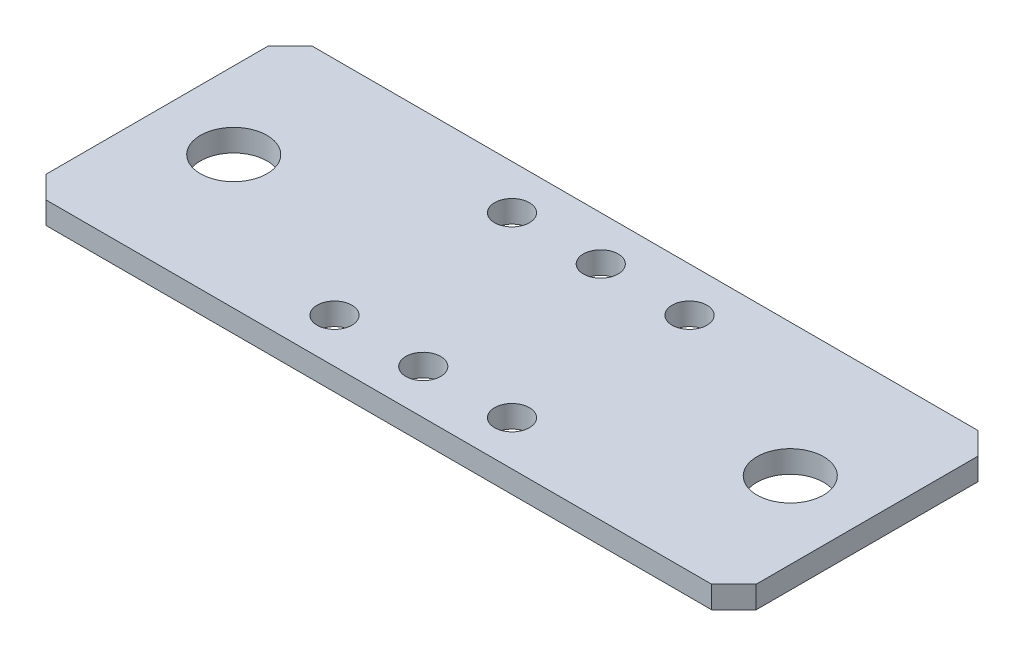
ISO-10303-21;
HEADER;
FILE_DESCRIPTION(('STEP AP214'),'2;1');
FILE_NAME('part.step','',(''),(''),'','','');
FILE_SCHEMA(('AUTOMOTIVE_DESIGN { 1 0 10303 214 1 1 1 1 }'));
ENDSEC;
DATA;
#1=APPLICATION_CONTEXT('core data for automotive mechanical design processes');
#2=APPLICATION_PROTOCOL_DEFINITION('international standard','automotive_design',2000,#1);
#3=PRODUCT_CONTEXT('',#1,'mechanical');
#4=PRODUCT('Part','Part','',(#3));
#5=PRODUCT_RELATED_PRODUCT_CATEGORY('part','',(#4));
#6=PRODUCT_DEFINITION_FORMATION('','',#4);
#7=PRODUCT_DEFINITION_CONTEXT('part definition',#1,'design');
#8=PRODUCT_DEFINITION('design','',#6,#7);
#9=PRODUCT_DEFINITION_SHAPE('','',#8);
#10=(LENGTH_UNIT() NAMED_UNIT(*) SI_UNIT(.MILLI.,.METRE.));
#11=(NAMED_UNIT(*) PLANE_ANGLE_UNIT() SI_UNIT($,.RADIAN.));
#12=(NAMED_UNIT(*) SI_UNIT($,.STERADIAN.) SOLID_ANGLE_UNIT());
#13=UNCERTAINTY_MEASURE_WITH_UNIT(LENGTH_MEASURE(1.E-05),#10,'distance_accuracy_value','');
#14=(GEOMETRIC_REPRESENTATION_CONTEXT(3) GLOBAL_UNCERTAINTY_ASSIGNED_CONTEXT((#13)) GLOBAL_UNIT_ASSIGNED_CONTEXT((#10,
#11,#12)) REPRESENTATION_CONTEXT('',''));
#15=CARTESIAN_POINT('',(0.,0.,0.));
#16=DIRECTION('',(0.,0.,1.));
#17=DIRECTION('',(1.,0.,0.));
#18=AXIS2_PLACEMENT_3D('',#15,#16,#17);
#19=CARTESIAN_POINT('',(0.,0.,0.));
#20=DIRECTION('',(0.,-1.,0.));
#21=DIRECTION('',(0.,0.,-1.));
#22=AXIS2_PLACEMENT_3D('',#19,#20,#21);
#23=PLANE('',#22);
#24=CARTESIAN_POINT('',(38.1,0.,-6.35));
#25=DIRECTION('',(0.,-1.,0.));
#26=DIRECTION('',(0.,0.,-1.));
#27=AXIS2_PLACEMENT_3D('',#24,#25,#26);
#28=CIRCLE('',#27,2.4892);
#29=CARTESIAN_POINT('',(38.1,0.,-8.83920000000001));
#30=VERTEX_POINT('',#29);
#31=EDGE_CURVE('E125',#30,#30,#28,.F.);
#32=ORIENTED_EDGE('',*,*,#31,.T.);
#33=EDGE_LOOP('',(#32));
#34=FACE_BOUND('',#33,.T.);
#35=CARTESIAN_POINT('',(63.5,0.,-6.35));
#36=DIRECTION('',(0.,-1.,0.));
#37=DIRECTION('',(0.,0.,-1.));
#38=AXIS2_PLACEMENT_3D('',#35,#36,#37);
#39=CIRCLE('',#38,2.4892);
#40=CARTESIAN_POINT('',(63.5,0.,-8.83920000000001));
#41=VERTEX_POINT('',#40);
#42=EDGE_CURVE('E131',#41,#41,#39,.F.);
#43=ORIENTED_EDGE('',*,*,#42,.T.);
#44=EDGE_LOOP('',(#43));
#45=FACE_BOUND('',#44,.T.);
#46=CARTESIAN_POINT('',(63.5,0.,-31.75));
#47=DIRECTION('',(0.,-1.,0.));
#48=DIRECTION('',(0.,0.,-1.));
#49=AXIS2_PLACEMENT_3D('',#46,#47,#48);
#50=CIRCLE('',#49,2.4892);
#51=CARTESIAN_POINT('',(63.5,0.,-34.2392));
#52=VERTEX_POINT('',#51);
#53=EDGE_CURVE('E137',#52,#52,#50,.F.);
#54=ORIENTED_EDGE('',*,*,#53,.T.);
#55=EDGE_LOOP('',(#54));
#56=FACE_BOUND('',#55,.T.);
#57=CARTESIAN_POINT('',(90.6145,0.,-19.05));
#58=DIRECTION('',(0.,-1.,0.));
#59=DIRECTION('',(0.,0.,-1.));
#60=AXIS2_PLACEMENT_3D('',#57,#58,#59);
#61=CIRCLE('',#60,4.7625);
#62=CARTESIAN_POINT('',(90.6145,0.,-23.8125));
#63=VERTEX_POINT('',#62);
#64=EDGE_CURVE('E142',#63,#63,#61,.F.);
#65=ORIENTED_EDGE('',*,*,#64,.T.);
#66=EDGE_LOOP('',(#65));
#67=FACE_BOUND('',#66,.T.);
#68=DIRECTION('',(0.,0.,1.));
#69=VECTOR('',#68,1.);
#70=CARTESIAN_POINT('',(101.6,0.,0.));
#71=LINE('',#70,#69);
#72=CARTESIAN_POINT('',(101.6,0.,-34.925));
#73=VERTEX_POINT('',#72);
#74=CARTESIAN_POINT('',(101.6,0.,-3.17499999999999));
#75=VERTEX_POINT('',#74);
#76=EDGE_CURVE('E170',#73,#75,#71,.T.);
#77=ORIENTED_EDGE('',*,*,#76,.T.);
#78=DIRECTION('',(-0.707106781186549,0.,0.707106781186546));
#79=VECTOR('',#78,1.);
#80=CARTESIAN_POINT('',(101.6,0.,-3.17499999999999));
#81=LINE('',#80,#79);
#82=CARTESIAN_POINT('',(98.425,0.,0.));
#83=VERTEX_POINT('',#82);
#84=EDGE_CURVE('E165',#75,#83,#81,.T.);
#85=ORIENTED_EDGE('',*,*,#84,.T.);
#86=DIRECTION('',(-1.,0.,0.));
#87=VECTOR('',#86,1.);
#88=CARTESIAN_POINT('',(0.,0.,0.));
#89=LINE('',#88,#87);
#90=CARTESIAN_POINT('',(3.175,0.,0.));
#91=VERTEX_POINT('',#90);
#92=EDGE_CURVE('E160',#83,#91,#89,.T.);
#93=ORIENTED_EDGE('',*,*,#92,.T.);
#94=DIRECTION('',(-0.707106781186546,0.,-0.707106781186549));
#95=VECTOR('',#94,1.);
#96=CARTESIAN_POINT('',(3.175,0.,0.));
#97=LINE('',#96,#95);
#98=CARTESIAN_POINT('',(0.,0.,-3.17500000000001));
#99=VERTEX_POINT('',#98);
#100=EDGE_CURVE('E155',#91,#99,#97,.T.);
#101=ORIENTED_EDGE('',*,*,#100,.T.);
#102=DIRECTION('',(0.,0.,-1.));
#103=VECTOR('',#102,1.);
#104=CARTESIAN_POINT('',(0.,0.,0.));
#105=LINE('',#104,#103);
#106=CARTESIAN_POINT('',(0.,0.,-34.925));
#107=VERTEX_POINT('',#106);
#108=EDGE_CURVE('E84',#99,#107,#105,.T.);
#109=ORIENTED_EDGE('',*,*,#108,.T.);
#110=DIRECTION('',(0.707106781186551,0.,-0.707106781186544));
#111=VECTOR('',#110,1.);
#112=CARTESIAN_POINT('',(0.,0.,-34.925));
#113=LINE('',#112,#111);
#114=CARTESIAN_POINT('',(3.175,0.,-38.1));
#115=VERTEX_POINT('',#114);
#116=EDGE_CURVE('E82',#107,#115,#113,.T.);
#117=ORIENTED_EDGE('',*,*,#116,.T.);
#118=DIRECTION('',(1.,0.,0.));
#119=VECTOR('',#118,1.);
#120=CARTESIAN_POINT('',(0.,0.,-38.1));
#121=LINE('',#120,#119);
#122=CARTESIAN_POINT('',(98.425,0.,-38.1));
#123=VERTEX_POINT('',#122);
#124=EDGE_CURVE('E79',#115,#123,#121,.T.);
#125=ORIENTED_EDGE('',*,*,#124,.T.);
#126=DIRECTION('',(0.707106781186544,0.,0.707106781186551));
#127=VECTOR('',#126,1.);
#128=CARTESIAN_POINT('',(98.425,0.,-38.1));
#129=LINE('',#128,#127);
#130=EDGE_CURVE('E175',#123,#73,#129,.T.);
#131=ORIENTED_EDGE('',*,*,#130,.T.);
#132=EDGE_LOOP('',(#77,#85,#93,#101,#109,#117,#125,#131));
#133=FACE_BOUND('',#132,.T.);
#134=CARTESIAN_POINT('',(10.9855,0.,-19.05));
#135=DIRECTION('',(0.,-1.,0.));
#136=DIRECTION('',(0.,0.,-1.));
#137=AXIS2_PLACEMENT_3D('',#134,#135,#136);
#138=CIRCLE('',#137,4.7625);
#139=CARTESIAN_POINT('',(10.9855,0.,-23.8125));
#140=VERTEX_POINT('',#139);
#141=EDGE_CURVE('E19',#140,#140,#138,.F.);
#142=ORIENTED_EDGE('',*,*,#141,.T.);
#143=EDGE_LOOP('',(#142));
#144=FACE_BOUND('',#143,.T.);
#145=CARTESIAN_POINT('',(50.8,0.,-31.75));
#146=DIRECTION('',(0.,-1.,0.));
#147=DIRECTION('',(0.,0.,-1.));
#148=AXIS2_PLACEMENT_3D('',#145,#146,#147);
#149=CIRCLE('',#148,2.4892);
#150=CARTESIAN_POINT('',(50.8,0.,-34.2392));
#151=VERTEX_POINT('',#150);
#152=EDGE_CURVE('E140',#151,#151,#149,.F.);
#153=ORIENTED_EDGE('',*,*,#152,.T.);
#154=EDGE_LOOP('',(#153));
#155=FACE_BOUND('',#154,.T.);
#156=CARTESIAN_POINT('',(38.1,0.,-31.75));
#157=DIRECTION('',(0.,-1.,0.));
#158=DIRECTION('',(0.,0.,-1.));
#159=AXIS2_PLACEMENT_3D('',#156,#157,#158);
#160=CIRCLE('',#159,2.4892);
#161=CARTESIAN_POINT('',(38.1,0.,-34.2392));
#162=VERTEX_POINT('',#161);
#163=EDGE_CURVE('E134',#162,#162,#160,.F.);
#164=ORIENTED_EDGE('',*,*,#163,.T.);
#165=EDGE_LOOP('',(#164));
#166=FACE_BOUND('',#165,.T.);
#167=CARTESIAN_POINT('',(50.8,0.,-6.35));
#168=DIRECTION('',(0.,-1.,0.));
#169=DIRECTION('',(0.,0.,-1.));
#170=AXIS2_PLACEMENT_3D('',#167,#168,#169);
#171=CIRCLE('',#170,2.4892);
#172=CARTESIAN_POINT('',(50.8,0.,-8.8392));
#173=VERTEX_POINT('',#172);
#174=EDGE_CURVE('E128',#173,#173,#171,.F.);
#175=ORIENTED_EDGE('',*,*,#174,.T.);
#176=EDGE_LOOP('',(#175));
#177=FACE_BOUND('',#176,.T.);
#178=ADVANCED_FACE('F16',(#34,#45,#56,#67,#133,#144,#155,#166,#177),#23,.T.);
#179=CARTESIAN_POINT('',(0.,3.175,-34.925));
#180=DIRECTION('',(0.707106781186544,0.,0.707106781186551));
#181=DIRECTION('',(0.707106781186551,0.,-0.707106781186544));
#182=AXIS2_PLACEMENT_3D('',#179,#180,#181);
#183=PLANE('',#182);
#184=DIRECTION('',(0.,1.,0.));
#185=VECTOR('',#184,1.);
#186=CARTESIAN_POINT('',(3.175,3.175,-38.1));
#187=LINE('',#186,#185);
#188=CARTESIAN_POINT('',(3.175,3.175,-38.1));
#189=VERTEX_POINT('',#188);
#190=EDGE_CURVE('E89',#189,#115,#187,.F.);
#191=ORIENTED_EDGE('',*,*,#190,.T.);
#192=ORIENTED_EDGE('',*,*,#116,.F.);
#193=DIRECTION('',(0.,1.,0.));
#194=VECTOR('',#193,1.);
#195=CARTESIAN_POINT('',(0.,3.175,-34.925));
#196=LINE('',#195,#194);
#197=CARTESIAN_POINT('',(0.,3.175,-34.925));
#198=VERTEX_POINT('',#197);
#199=EDGE_CURVE('E149',#107,#198,#196,.T.);
#200=ORIENTED_EDGE('',*,*,#199,.T.);
#201=DIRECTION('',(0.707106781186549,0.,-0.707106781186546));
#202=VECTOR('',#201,1.);
#203=CARTESIAN_POINT('',(0.,3.175,-34.925));
#204=LINE('',#203,#202);
#205=EDGE_CURVE('E100',#198,#189,#204,.T.);
#206=ORIENTED_EDGE('',*,*,#205,.T.);
#207=EDGE_LOOP('',(#191,#192,#200,#206));
#208=FACE_BOUND('',#207,.T.);
#209=ADVANCED_FACE('F99',(#208),#183,.F.);
#210=CARTESIAN_POINT('',(0.,3.175,-38.1));
#211=DIRECTION('',(0.,0.,1.));
#212=DIRECTION('',(1.,0.,0.));
#213=AXIS2_PLACEMENT_3D('',#210,#211,#212);
#214=PLANE('',#213);
#215=ORIENTED_EDGE('',*,*,#190,.F.);
#216=DIRECTION('',(1.,0.,0.));
#217=VECTOR('',#216,1.);
#218=CARTESIAN_POINT('',(0.,3.175,-38.1));
#219=LINE('',#218,#217);
#220=CARTESIAN_POINT('',(98.425,3.175,-38.1));
#221=VERTEX_POINT('',#220);
#222=EDGE_CURVE('E189',#189,#221,#219,.T.);
#223=ORIENTED_EDGE('',*,*,#222,.T.);
#224=DIRECTION('',(0.,1.,0.));
#225=VECTOR('',#224,1.);
#226=CARTESIAN_POINT('',(98.425,3.175,-38.1));
#227=LINE('',#226,#225);
#228=EDGE_CURVE('E96',#221,#123,#227,.F.);
#229=ORIENTED_EDGE('',*,*,#228,.T.);
#230=ORIENTED_EDGE('',*,*,#124,.F.);
#231=EDGE_LOOP('',(#215,#223,#229,#230));
#232=FACE_BOUND('',#231,.T.);
#233=ADVANCED_FACE('F93',(#232),#214,.F.);
#234=CARTESIAN_POINT('',(98.425,3.175,-38.1));
#235=DIRECTION('',(-0.707106781186551,0.,0.707106781186544));
#236=DIRECTION('',(0.707106781186544,0.,0.707106781186551));
#237=AXIS2_PLACEMENT_3D('',#234,#235,#236);
#238=PLANE('',#237);
#239=DIRECTION('',(0.,1.,0.));
#240=VECTOR('',#239,1.);
#241=CARTESIAN_POINT('',(101.6,3.175,-34.925));
#242=LINE('',#241,#240);
#243=CARTESIAN_POINT('',(101.6,3.175,-34.925));
#244=VERTEX_POINT('',#243);
#245=EDGE_CURVE('E172',#244,#73,#242,.F.);
#246=ORIENTED_EDGE('',*,*,#245,.T.);
#247=ORIENTED_EDGE('',*,*,#130,.F.);
#248=ORIENTED_EDGE('',*,*,#228,.F.);
#249=DIRECTION('',(0.707106781186544,0.,0.707106781186551));
#250=VECTOR('',#249,1.);
#251=CARTESIAN_POINT('',(98.425,3.175,-38.1));
#252=LINE('',#251,#250);
#253=EDGE_CURVE('E186',#221,#244,#252,.T.);
#254=ORIENTED_EDGE('',*,*,#253,.T.);
#255=EDGE_LOOP('',(#246,#247,#248,#254));
#256=FACE_BOUND('',#255,.T.);
#257=ADVANCED_FACE('F184',(#256),#238,.F.);
#258=CARTESIAN_POINT('',(101.6,3.175,0.));
#259=DIRECTION('',(-1.,0.,0.));
#260=DIRECTION('',(0.,0.,1.));
#261=AXIS2_PLACEMENT_3D('',#258,#259,#260);
#262=PLANE('',#261);
#263=ORIENTED_EDGE('',*,*,#245,.F.);
#264=DIRECTION('',(0.,0.,-1.));
#265=VECTOR('',#264,1.);
#266=CARTESIAN_POINT('',(101.6,3.175,0.));
#267=LINE('',#266,#265);
#268=CARTESIAN_POINT('',(101.6,3.175,-3.17499999999999));
#269=VERTEX_POINT('',#268);
#270=EDGE_CURVE('E188',#244,#269,#267,.F.);
#271=ORIENTED_EDGE('',*,*,#270,.T.);
#272=DIRECTION('',(0.,1.,0.));
#273=VECTOR('',#272,1.);
#274=CARTESIAN_POINT('',(101.6,3.175,-3.17499999999999));
#275=LINE('',#274,#273);
#276=EDGE_CURVE('E167',#269,#75,#275,.F.);
#277=ORIENTED_EDGE('',*,*,#276,.T.);
#278=ORIENTED_EDGE('',*,*,#76,.F.);
#279=EDGE_LOOP('',(#263,#271,#277,#278));
#280=FACE_BOUND('',#279,.T.);
#281=ADVANCED_FACE('F180',(#280),#262,.F.);
#282=CARTESIAN_POINT('',(101.6,3.175,-3.17499999999999));
#283=DIRECTION('',(-0.707106781186546,0.,-0.707106781186549));
#284=DIRECTION('',(-0.707106781186549,0.,0.707106781186546));
#285=AXIS2_PLACEMENT_3D('',#282,#283,#284);
#286=PLANE('',#285);
#287=DIRECTION('',(0.,1.,0.));
#288=VECTOR('',#287,1.);
#289=CARTESIAN_POINT('',(98.425,3.175,0.));
#290=LINE('',#289,#288);
#291=CARTESIAN_POINT('',(98.425,3.175,0.));
#292=VERTEX_POINT('',#291);
#293=EDGE_CURVE('E162',#292,#83,#290,.F.);
#294=ORIENTED_EDGE('',*,*,#293,.T.);
#295=ORIENTED_EDGE('',*,*,#84,.F.);
#296=ORIENTED_EDGE('',*,*,#276,.F.);
#297=DIRECTION('',(-0.707106781186549,0.,0.707106781186546));
#298=VECTOR('',#297,1.);
#299=CARTESIAN_POINT('',(101.6,3.175,-3.17499999999999));
#300=LINE('',#299,#298);
#301=EDGE_CURVE('E191',#269,#292,#300,.T.);
#302=ORIENTED_EDGE('',*,*,#301,.T.);
#303=EDGE_LOOP('',(#294,#295,#296,#302));
#304=FACE_BOUND('',#303,.T.);
#305=ADVANCED_FACE('F214',(#304),#286,.F.);
#306=CARTESIAN_POINT('',(0.,3.175,0.));
#307=DIRECTION('',(0.,0.,-1.));
#308=DIRECTION('',(-1.,0.,0.));
#309=AXIS2_PLACEMENT_3D('',#306,#307,#308);
#310=PLANE('',#309);
#311=DIRECTION('',(0.,1.,0.));
#312=VECTOR('',#311,1.);
#313=CARTESIAN_POINT('',(3.175,3.175,0.));
#314=LINE('',#313,#312);
#315=CARTESIAN_POINT('',(3.175,3.175,0.));
#316=VERTEX_POINT('',#315);
#317=EDGE_CURVE('E157',#316,#91,#314,.F.);
#318=ORIENTED_EDGE('',*,*,#317,.T.);
#319=ORIENTED_EDGE('',*,*,#92,.F.);
#320=ORIENTED_EDGE('',*,*,#293,.F.);
#321=DIRECTION('',(1.,0.,0.));
#322=VECTOR('',#321,1.);
#323=CARTESIAN_POINT('',(0.,3.175,0.));
#324=LINE('',#323,#322);
#325=EDGE_CURVE('E196',#292,#316,#324,.F.);
#326=ORIENTED_EDGE('',*,*,#325,.T.);
#327=EDGE_LOOP('',(#318,#319,#320,#326));
#328=FACE_BOUND('',#327,.T.);
#329=ADVANCED_FACE('F211',(#328),#310,.F.);
#330=CARTESIAN_POINT('',(3.175,3.175,0.));
#331=DIRECTION('',(0.707106781186549,0.,-0.707106781186546));
#332=DIRECTION('',(-0.707106781186546,0.,-0.707106781186549));
#333=AXIS2_PLACEMENT_3D('',#330,#331,#332);
#334=PLANE('',#333);
#335=DIRECTION('',(0.,1.,0.));
#336=VECTOR('',#335,1.);
#337=CARTESIAN_POINT('',(0.,3.175,-3.17500000000001));
#338=LINE('',#337,#336);
#339=CARTESIAN_POINT('',(0.,3.175,-3.17500000000001));
#340=VERTEX_POINT('',#339);
#341=EDGE_CURVE('E34',#340,#99,#338,.F.);
#342=ORIENTED_EDGE('',*,*,#341,.T.);
#343=ORIENTED_EDGE('',*,*,#100,.F.);
#344=ORIENTED_EDGE('',*,*,#317,.F.);
#345=DIRECTION('',(-0.707106781186546,0.,-0.707106781186549));
#346=VECTOR('',#345,1.);
#347=CARTESIAN_POINT('',(3.175,3.175,0.));
#348=LINE('',#347,#346);
#349=EDGE_CURVE('E199',#316,#340,#348,.T.);
#350=ORIENTED_EDGE('',*,*,#349,.T.);
#351=EDGE_LOOP('',(#342,#343,#344,#350));
#352=FACE_BOUND('',#351,.T.);
#353=ADVANCED_FACE('F207',(#352),#334,.F.);
#354=CARTESIAN_POINT('',(0.,3.175,0.));
#355=DIRECTION('',(1.,0.,0.));
#356=DIRECTION('',(0.,0.,-1.));
#357=AXIS2_PLACEMENT_3D('',#354,#355,#356);
#358=PLANE('',#357);
#359=ORIENTED_EDGE('',*,*,#341,.F.);
#360=DIRECTION('',(0.,0.,-1.));
#361=VECTOR('',#360,1.);
#362=CARTESIAN_POINT('',(0.,3.175,0.));
#363=LINE('',#362,#361);
#364=EDGE_CURVE('E124',#340,#198,#363,.T.);
#365=ORIENTED_EDGE('',*,*,#364,.T.);
#366=ORIENTED_EDGE('',*,*,#199,.F.);
#367=ORIENTED_EDGE('',*,*,#108,.F.);
#368=EDGE_LOOP('',(#359,#365,#366,#367));
#369=FACE_BOUND('',#368,.T.);
#370=ADVANCED_FACE('F202',(#369),#358,.F.);
#371=CARTESIAN_POINT('',(10.9855,3.175,-19.05));
#372=DIRECTION('',(0.,-1.,0.));
#373=DIRECTION('',(0.,0.,-1.));
#374=AXIS2_PLACEMENT_3D('',#371,#372,#373);
#375=CYLINDRICAL_SURFACE('',#374,4.7625);
#376=ORIENTED_EDGE('',*,*,#141,.F.);
#377=EDGE_LOOP('',(#376));
#378=FACE_BOUND('',#377,.T.);
#379=CARTESIAN_POINT('',(10.9855,3.175,-19.05));
#380=DIRECTION('',(0.,-1.,0.));
#381=DIRECTION('',(0.,0.,-1.));
#382=AXIS2_PLACEMENT_3D('',#379,#380,#381);
#383=CIRCLE('',#382,4.7625);
#384=CARTESIAN_POINT('',(10.9855,3.175,-23.8125));
#385=VERTEX_POINT('',#384);
#386=EDGE_CURVE('E121',#385,#385,#383,.F.);
#387=ORIENTED_EDGE('',*,*,#386,.T.);
#388=EDGE_LOOP('',(#387));
#389=FACE_BOUND('',#388,.T.);
#390=ADVANCED_FACE('F259',(#378,#389),#375,.F.);
#391=CARTESIAN_POINT('',(90.6145,3.175,-19.05));
#392=DIRECTION('',(0.,-1.,0.));
#393=DIRECTION('',(0.,0.,-1.));
#394=AXIS2_PLACEMENT_3D('',#391,#392,#393);
#395=CYLINDRICAL_SURFACE('',#394,4.7625);
#396=ORIENTED_EDGE('',*,*,#64,.F.);
#397=EDGE_LOOP('',(#396));
#398=FACE_BOUND('',#397,.T.);
#399=CARTESIAN_POINT('',(90.6145,3.175,-19.05));
#400=DIRECTION('',(0.,-1.,0.));
#401=DIRECTION('',(0.,0.,-1.));
#402=AXIS2_PLACEMENT_3D('',#399,#400,#401);
#403=CIRCLE('',#402,4.7625);
#404=CARTESIAN_POINT('',(90.6145,3.175,-23.8125));
#405=VERTEX_POINT('',#404);
#406=EDGE_CURVE('E118',#405,#405,#403,.F.);
#407=ORIENTED_EDGE('',*,*,#406,.T.);
#408=EDGE_LOOP('',(#407));
#409=FACE_BOUND('',#408,.T.);
#410=ADVANCED_FACE('F255',(#398,#409),#395,.F.);
#411=CARTESIAN_POINT('',(50.8,3.175,-31.75));
#412=DIRECTION('',(0.,-1.,0.));
#413=DIRECTION('',(0.,0.,-1.));
#414=AXIS2_PLACEMENT_3D('',#411,#412,#413);
#415=CYLINDRICAL_SURFACE('',#414,2.4892);
#416=ORIENTED_EDGE('',*,*,#152,.F.);
#417=EDGE_LOOP('',(#416));
#418=FACE_BOUND('',#417,.T.);
#419=CARTESIAN_POINT('',(50.8,3.175,-31.75));
#420=DIRECTION('',(0.,-1.,0.));
#421=DIRECTION('',(0.,0.,-1.));
#422=AXIS2_PLACEMENT_3D('',#419,#420,#421);
#423=CIRCLE('',#422,2.4892);
#424=CARTESIAN_POINT('',(50.8,3.175,-34.2392));
#425=VERTEX_POINT('',#424);
#426=EDGE_CURVE('E115',#425,#425,#423,.F.);
#427=ORIENTED_EDGE('',*,*,#426,.T.);
#428=EDGE_LOOP('',(#427));
#429=FACE_BOUND('',#428,.T.);
#430=ADVANCED_FACE('F251',(#418,#429),#415,.F.);
#431=CARTESIAN_POINT('',(63.5,3.175,-31.75));
#432=DIRECTION('',(0.,-1.,0.));
#433=DIRECTION('',(0.,0.,-1.));
#434=AXIS2_PLACEMENT_3D('',#431,#432,#433);
#435=CYLINDRICAL_SURFACE('',#434,2.4892);
#436=ORIENTED_EDGE('',*,*,#53,.F.);
#437=EDGE_LOOP('',(#436));
#438=FACE_BOUND('',#437,.T.);
#439=CARTESIAN_POINT('',(63.5,3.175,-31.75));
#440=DIRECTION('',(0.,-1.,0.));
#441=DIRECTION('',(0.,0.,-1.));
#442=AXIS2_PLACEMENT_3D('',#439,#440,#441);
#443=CIRCLE('',#442,2.4892);
#444=CARTESIAN_POINT('',(63.5,3.175,-34.2392));
#445=VERTEX_POINT('',#444);
#446=EDGE_CURVE('E112',#445,#445,#443,.F.);
#447=ORIENTED_EDGE('',*,*,#446,.T.);
#448=EDGE_LOOP('',(#447));
#449=FACE_BOUND('',#448,.T.);
#450=ADVANCED_FACE('F247',(#438,#449),#435,.F.);
#451=CARTESIAN_POINT('',(38.1,3.175,-31.75));
#452=DIRECTION('',(0.,-1.,0.));
#453=DIRECTION('',(0.,0.,-1.));
#454=AXIS2_PLACEMENT_3D('',#451,#452,#453);
#455=CYLINDRICAL_SURFACE('',#454,2.4892);
#456=ORIENTED_EDGE('',*,*,#163,.F.);
#457=EDGE_LOOP('',(#456));
#458=FACE_BOUND('',#457,.T.);
#459=CARTESIAN_POINT('',(38.1,3.175,-31.75));
#460=DIRECTION('',(0.,-1.,0.));
#461=DIRECTION('',(0.,0.,-1.));
#462=AXIS2_PLACEMENT_3D('',#459,#460,#461);
#463=CIRCLE('',#462,2.4892);
#464=CARTESIAN_POINT('',(38.1,3.175,-34.2392));
#465=VERTEX_POINT('',#464);
#466=EDGE_CURVE('E109',#465,#465,#463,.F.);
#467=ORIENTED_EDGE('',*,*,#466,.T.);
#468=EDGE_LOOP('',(#467));
#469=FACE_BOUND('',#468,.T.);
#470=ADVANCED_FACE('F243',(#458,#469),#455,.F.);
#471=CARTESIAN_POINT('',(63.5,3.175,-6.35));
#472=DIRECTION('',(0.,-1.,0.));
#473=DIRECTION('',(0.,0.,-1.));
#474=AXIS2_PLACEMENT_3D('',#471,#472,#473);
#475=CYLINDRICAL_SURFACE('',#474,2.4892);
#476=ORIENTED_EDGE('',*,*,#42,.F.);
#477=EDGE_LOOP('',(#476));
#478=FACE_BOUND('',#477,.T.);
#479=CARTESIAN_POINT('',(63.5,3.175,-6.35));
#480=DIRECTION('',(0.,-1.,0.));
#481=DIRECTION('',(0.,0.,-1.));
#482=AXIS2_PLACEMENT_3D('',#479,#480,#481);
#483=CIRCLE('',#482,2.4892);
#484=CARTESIAN_POINT('',(63.5,3.175,-8.83920000000001));
#485=VERTEX_POINT('',#484);
#486=EDGE_CURVE('E106',#485,#485,#483,.F.);
#487=ORIENTED_EDGE('',*,*,#486,.T.);
#488=EDGE_LOOP('',(#487));
#489=FACE_BOUND('',#488,.T.);
#490=ADVANCED_FACE('F239',(#478,#489),#475,.F.);
#491=CARTESIAN_POINT('',(50.8,3.175,-6.35));
#492=DIRECTION('',(0.,-1.,0.));
#493=DIRECTION('',(0.,0.,-1.));
#494=AXIS2_PLACEMENT_3D('',#491,#492,#493);
#495=CYLINDRICAL_SURFACE('',#494,2.4892);
#496=ORIENTED_EDGE('',*,*,#174,.F.);
#497=EDGE_LOOP('',(#496));
#498=FACE_BOUND('',#497,.T.);
#499=CARTESIAN_POINT('',(50.8,3.175,-6.35));
#500=DIRECTION('',(0.,-1.,0.));
#501=DIRECTION('',(0.,0.,-1.));
#502=AXIS2_PLACEMENT_3D('',#499,#500,#501);
#503=CIRCLE('',#502,2.4892);
#504=CARTESIAN_POINT('',(50.8,3.175,-8.8392));
#505=VERTEX_POINT('',#504);
#506=EDGE_CURVE('E25',#505,#505,#503,.F.);
#507=ORIENTED_EDGE('',*,*,#506,.T.);
#508=EDGE_LOOP('',(#507));
#509=FACE_BOUND('',#508,.T.);
#510=ADVANCED_FACE('F231',(#498,#509),#495,.F.);
#511=CARTESIAN_POINT('',(38.1,3.175,-6.35));
#512=DIRECTION('',(0.,-1.,0.));
#513=DIRECTION('',(0.,0.,-1.));
#514=AXIS2_PLACEMENT_3D('',#511,#512,#513);
#515=CYLINDRICAL_SURFACE('',#514,2.4892);
#516=ORIENTED_EDGE('',*,*,#31,.F.);
#517=EDGE_LOOP('',(#516));
#518=FACE_BOUND('',#517,.T.);
#519=CARTESIAN_POINT('',(38.1,3.175,-6.35));
#520=DIRECTION('',(0.,-1.,0.));
#521=DIRECTION('',(0.,0.,-1.));
#522=AXIS2_PLACEMENT_3D('',#519,#520,#521);
#523=CIRCLE('',#522,2.4892);
#524=CARTESIAN_POINT('',(38.1,3.175,-8.83920000000001));
#525=VERTEX_POINT('',#524);
#526=EDGE_CURVE('E11',#525,#525,#523,.F.);
#527=ORIENTED_EDGE('',*,*,#526,.T.);
#528=EDGE_LOOP('',(#527));
#529=FACE_BOUND('',#528,.T.);
#530=ADVANCED_FACE('F225',(#518,#529),#515,.F.);
#531=CARTESIAN_POINT('',(0.,3.175,0.));
#532=DIRECTION('',(0.,-1.,0.));
#533=DIRECTION('',(0.,0.,-1.));
#534=AXIS2_PLACEMENT_3D('',#531,#532,#533);
#535=PLANE('',#534);
#536=ORIENTED_EDGE('',*,*,#526,.F.);
#537=EDGE_LOOP('',(#536));
#538=FACE_BOUND('',#537,.T.);
#539=ORIENTED_EDGE('',*,*,#506,.F.);
#540=EDGE_LOOP('',(#539));
#541=FACE_BOUND('',#540,.T.);
#542=ORIENTED_EDGE('',*,*,#486,.F.);
#543=EDGE_LOOP('',(#542));
#544=FACE_BOUND('',#543,.T.);
#545=ORIENTED_EDGE('',*,*,#466,.F.);
#546=EDGE_LOOP('',(#545));
#547=FACE_BOUND('',#546,.T.);
#548=ORIENTED_EDGE('',*,*,#446,.F.);
#549=EDGE_LOOP('',(#548));
#550=FACE_BOUND('',#549,.T.);
#551=ORIENTED_EDGE('',*,*,#426,.F.);
#552=EDGE_LOOP('',(#551));
#553=FACE_BOUND('',#552,.T.);
#554=ORIENTED_EDGE('',*,*,#406,.F.);
#555=EDGE_LOOP('',(#554));
#556=FACE_BOUND('',#555,.T.);
#557=ORIENTED_EDGE('',*,*,#386,.F.);
#558=EDGE_LOOP('',(#557));
#559=FACE_BOUND('',#558,.T.);
#560=ORIENTED_EDGE('',*,*,#349,.F.);
#561=ORIENTED_EDGE('',*,*,#325,.F.);
#562=ORIENTED_EDGE('',*,*,#301,.F.);
#563=ORIENTED_EDGE('',*,*,#270,.F.);
#564=ORIENTED_EDGE('',*,*,#253,.F.);
#565=ORIENTED_EDGE('',*,*,#222,.F.);
#566=ORIENTED_EDGE('',*,*,#205,.F.);
#567=ORIENTED_EDGE('',*,*,#364,.F.);
#568=EDGE_LOOP('',(#560,#561,#562,#563,#564,#565,#566,#567));
#569=FACE_BOUND('',#568,.T.);
#570=ADVANCED_FACE('F204',(#538,#541,#544,#547,#550,#553,#556,#559,#569),#535,.F.);
#571=CLOSED_SHELL('',(#178,#209,#233,#257,#281,#305,#329,#353,#370,#390,#410,#430,#450,#470,
#490,#510,#530,#570));
#572=MANIFOLD_SOLID_BREP('B1',#571);
#573=ADVANCED_BREP_SHAPE_REPRESENTATION('',(#18,#572),#14);
#574=SHAPE_DEFINITION_REPRESENTATION(#9,#573);
ENDSEC;
END-ISO-10303-21;
